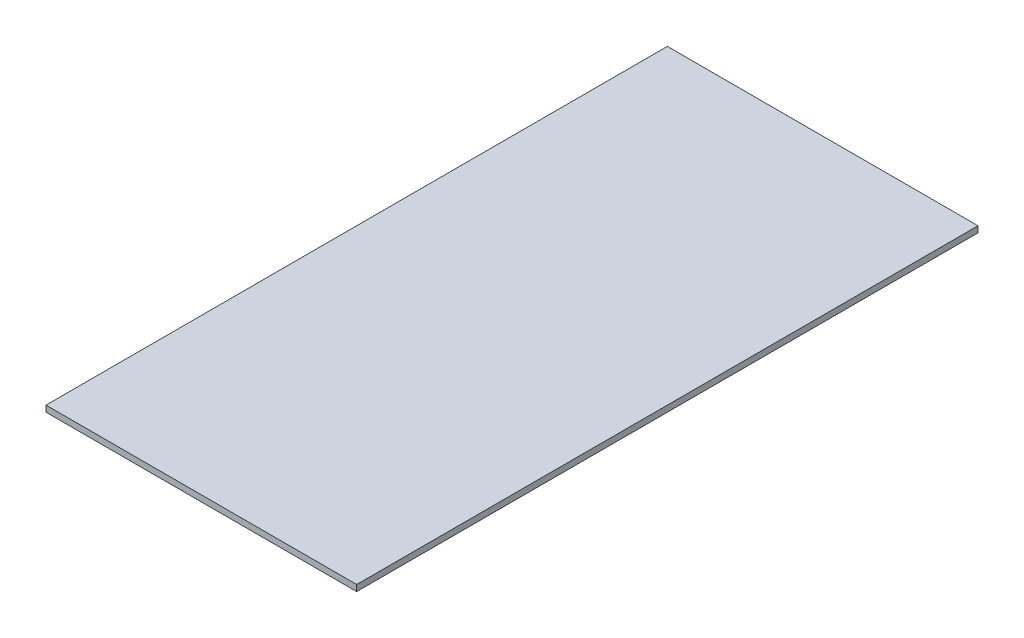
ISO-10303-21;
HEADER;
FILE_DESCRIPTION(('STEP AP214'),'2;1');
FILE_NAME('part.step','',(''),(''),'','','');
FILE_SCHEMA(('AUTOMOTIVE_DESIGN { 1 0 10303 214 1 1 1 1 }'));
ENDSEC;
DATA;
#1=APPLICATION_CONTEXT('core data for automotive mechanical design processes');
#2=APPLICATION_PROTOCOL_DEFINITION('international standard','automotive_design',2000,#1);
#3=PRODUCT_CONTEXT('',#1,'mechanical');
#4=PRODUCT('Part','Part','',(#3));
#5=PRODUCT_RELATED_PRODUCT_CATEGORY('part','',(#4));
#6=PRODUCT_DEFINITION_FORMATION('','',#4);
#7=PRODUCT_DEFINITION_CONTEXT('part definition',#1,'design');
#8=PRODUCT_DEFINITION('design','',#6,#7);
#9=PRODUCT_DEFINITION_SHAPE('','',#8);
#10=(LENGTH_UNIT() NAMED_UNIT(*) SI_UNIT(.MILLI.,.METRE.));
#11=(NAMED_UNIT(*) PLANE_ANGLE_UNIT() SI_UNIT($,.RADIAN.));
#12=(NAMED_UNIT(*) SI_UNIT($,.STERADIAN.) SOLID_ANGLE_UNIT());
#13=UNCERTAINTY_MEASURE_WITH_UNIT(LENGTH_MEASURE(1.E-05),#10,'distance_accuracy_value','');
#14=(GEOMETRIC_REPRESENTATION_CONTEXT(3) GLOBAL_UNCERTAINTY_ASSIGNED_CONTEXT((#13)) GLOBAL_UNIT_ASSIGNED_CONTEXT((#10,
#11,#12)) REPRESENTATION_CONTEXT('',''));
#15=CARTESIAN_POINT('',(0.,0.,0.));
#16=DIRECTION('',(0.,0.,1.));
#17=DIRECTION('',(1.,0.,0.));
#18=AXIS2_PLACEMENT_3D('',#15,#16,#17);
#19=CARTESIAN_POINT('',(152.4,3.0226,304.8));
#20=DIRECTION('',(-1.,0.,0.));
#21=DIRECTION('',(0.,0.,1.));
#22=AXIS2_PLACEMENT_3D('',#19,#20,#21);
#23=PLANE('',#22);
#24=DIRECTION('',(0.,0.,-1.));
#25=VECTOR('',#24,1.);
#26=CARTESIAN_POINT('',(152.4,-3.0226,304.8));
#27=LINE('',#26,#25);
#28=CARTESIAN_POINT('',(152.4,-3.0226,304.8));
#29=VERTEX_POINT('',#28);
#30=CARTESIAN_POINT('',(152.4,-3.0226,-304.8));
#31=VERTEX_POINT('',#30);
#32=EDGE_CURVE('E113',#29,#31,#27,.T.);
#33=ORIENTED_EDGE('',*,*,#32,.T.);
#34=DIRECTION('',(0.,-1.,0.));
#35=VECTOR('',#34,1.);
#36=CARTESIAN_POINT('',(152.4,3.0226,-304.8));
#37=LINE('',#36,#35);
#38=CARTESIAN_POINT('',(152.4,3.0226,-304.8));
#39=VERTEX_POINT('',#38);
#40=EDGE_CURVE('E11',#39,#31,#37,.T.);
#41=ORIENTED_EDGE('',*,*,#40,.F.);
#42=DIRECTION('',(0.,0.,-1.));
#43=VECTOR('',#42,1.);
#44=CARTESIAN_POINT('',(152.4,3.0226,304.8));
#45=LINE('',#44,#43);
#46=CARTESIAN_POINT('',(152.4,3.0226,304.8));
#47=VERTEX_POINT('',#46);
#48=EDGE_CURVE('E97',#47,#39,#45,.T.);
#49=ORIENTED_EDGE('',*,*,#48,.F.);
#50=DIRECTION('',(0.,-1.,0.));
#51=VECTOR('',#50,1.);
#52=CARTESIAN_POINT('',(152.4,3.0226,304.8));
#53=LINE('',#52,#51);
#54=EDGE_CURVE('E109',#47,#29,#53,.T.);
#55=ORIENTED_EDGE('',*,*,#54,.T.);
#56=EDGE_LOOP('',(#33,#41,#49,#55));
#57=FACE_BOUND('',#56,.T.);
#58=ADVANCED_FACE('F45',(#57),#23,.F.);
#59=CARTESIAN_POINT('',(-152.4,3.0226,-304.8));
#60=DIRECTION('',(0.,0.,1.));
#61=DIRECTION('',(1.,0.,0.));
#62=AXIS2_PLACEMENT_3D('',#59,#60,#61);
#63=PLANE('',#62);
#64=DIRECTION('',(-1.,0.,0.));
#65=VECTOR('',#64,1.);
#66=CARTESIAN_POINT('',(-152.4,-3.0226,-304.8));
#67=LINE('',#66,#65);
#68=CARTESIAN_POINT('',(-152.4,-3.0226,-304.8));
#69=VERTEX_POINT('',#68);
#70=EDGE_CURVE('E102',#31,#69,#67,.T.);
#71=ORIENTED_EDGE('',*,*,#70,.T.);
#72=DIRECTION('',(0.,-1.,0.));
#73=VECTOR('',#72,1.);
#74=CARTESIAN_POINT('',(-152.4,3.0226,-304.8));
#75=LINE('',#74,#73);
#76=CARTESIAN_POINT('',(-152.4,3.0226,-304.8));
#77=VERTEX_POINT('',#76);
#78=EDGE_CURVE('E54',#77,#69,#75,.T.);
#79=ORIENTED_EDGE('',*,*,#78,.F.);
#80=DIRECTION('',(-1.,0.,0.));
#81=VECTOR('',#80,1.);
#82=CARTESIAN_POINT('',(-152.4,3.0226,-304.8));
#83=LINE('',#82,#81);
#84=EDGE_CURVE('E92',#39,#77,#83,.T.);
#85=ORIENTED_EDGE('',*,*,#84,.F.);
#86=ORIENTED_EDGE('',*,*,#40,.T.);
#87=EDGE_LOOP('',(#71,#79,#85,#86));
#88=FACE_BOUND('',#87,.T.);
#89=ADVANCED_FACE('F101',(#88),#63,.F.);
#90=CARTESIAN_POINT('',(-152.4,3.0226,304.8));
#91=DIRECTION('',(1.,0.,0.));
#92=DIRECTION('',(0.,0.,-1.));
#93=AXIS2_PLACEMENT_3D('',#90,#91,#92);
#94=PLANE('',#93);
#95=DIRECTION('',(0.,0.,1.));
#96=VECTOR('',#95,1.);
#97=CARTESIAN_POINT('',(-152.4,-3.0226,304.8));
#98=LINE('',#97,#96);
#99=CARTESIAN_POINT('',(-152.4,-3.0226,304.8));
#100=VERTEX_POINT('',#99);
#101=EDGE_CURVE('E79',#69,#100,#98,.T.);
#102=ORIENTED_EDGE('',*,*,#101,.T.);
#103=DIRECTION('',(0.,-1.,0.));
#104=VECTOR('',#103,1.);
#105=CARTESIAN_POINT('',(-152.4,3.0226,304.8));
#106=LINE('',#105,#104);
#107=CARTESIAN_POINT('',(-152.4,3.0226,304.8));
#108=VERTEX_POINT('',#107);
#109=EDGE_CURVE('E104',#108,#100,#106,.T.);
#110=ORIENTED_EDGE('',*,*,#109,.F.);
#111=DIRECTION('',(0.,0.,1.));
#112=VECTOR('',#111,1.);
#113=CARTESIAN_POINT('',(-152.4,3.0226,304.8));
#114=LINE('',#113,#112);
#115=EDGE_CURVE('E95',#77,#108,#114,.T.);
#116=ORIENTED_EDGE('',*,*,#115,.F.);
#117=ORIENTED_EDGE('',*,*,#78,.T.);
#118=EDGE_LOOP('',(#102,#110,#116,#117));
#119=FACE_BOUND('',#118,.T.);
#120=ADVANCED_FACE('F105',(#119),#94,.F.);
#121=CARTESIAN_POINT('',(-152.4,3.0226,304.8));
#122=DIRECTION('',(0.,0.,-1.));
#123=DIRECTION('',(-1.,0.,0.));
#124=AXIS2_PLACEMENT_3D('',#121,#122,#123);
#125=PLANE('',#124);
#126=DIRECTION('',(1.,0.,0.));
#127=VECTOR('',#126,1.);
#128=CARTESIAN_POINT('',(-152.4,-3.0226,304.8));
#129=LINE('',#128,#127);
#130=EDGE_CURVE('E85',#100,#29,#129,.T.);
#131=ORIENTED_EDGE('',*,*,#130,.T.);
#132=ORIENTED_EDGE('',*,*,#54,.F.);
#133=DIRECTION('',(1.,0.,0.));
#134=VECTOR('',#133,1.);
#135=CARTESIAN_POINT('',(-152.4,3.0226,304.8));
#136=LINE('',#135,#134);
#137=EDGE_CURVE('E62',#108,#47,#136,.T.);
#138=ORIENTED_EDGE('',*,*,#137,.F.);
#139=ORIENTED_EDGE('',*,*,#109,.T.);
#140=EDGE_LOOP('',(#131,#132,#138,#139));
#141=FACE_BOUND('',#140,.T.);
#142=ADVANCED_FACE('F126',(#141),#125,.F.);
#143=CARTESIAN_POINT('',(0.,3.0226,0.));
#144=DIRECTION('',(0.,-1.,0.));
#145=DIRECTION('',(0.,0.,-1.));
#146=AXIS2_PLACEMENT_3D('',#143,#144,#145);
#147=PLANE('',#146);
#148=ORIENTED_EDGE('',*,*,#48,.T.);
#149=ORIENTED_EDGE('',*,*,#84,.T.);
#150=ORIENTED_EDGE('',*,*,#115,.T.);
#151=ORIENTED_EDGE('',*,*,#137,.T.);
#152=EDGE_LOOP('',(#148,#149,#150,#151));
#153=FACE_BOUND('',#152,.T.);
#154=ADVANCED_FACE('F93',(#153),#147,.F.);
#155=CARTESIAN_POINT('',(0.,-3.0226,0.));
#156=DIRECTION('',(0.,-1.,0.));
#157=DIRECTION('',(0.,0.,-1.));
#158=AXIS2_PLACEMENT_3D('',#155,#156,#157);
#159=PLANE('',#158);
#160=ORIENTED_EDGE('',*,*,#32,.F.);
#161=ORIENTED_EDGE('',*,*,#130,.F.);
#162=ORIENTED_EDGE('',*,*,#101,.F.);
#163=ORIENTED_EDGE('',*,*,#70,.F.);
#164=EDGE_LOOP('',(#160,#161,#162,#163));
#165=FACE_BOUND('',#164,.T.);
#166=ADVANCED_FACE('F129',(#165),#159,.T.);
#167=CLOSED_SHELL('',(#58,#89,#120,#142,#154,#166));
#168=MANIFOLD_SOLID_BREP('B2',#167);
#169=ADVANCED_BREP_SHAPE_REPRESENTATION('',(#18,#168),#14);
#170=SHAPE_DEFINITION_REPRESENTATION(#9,#169);
ENDSEC;
END-ISO-10303-21;
